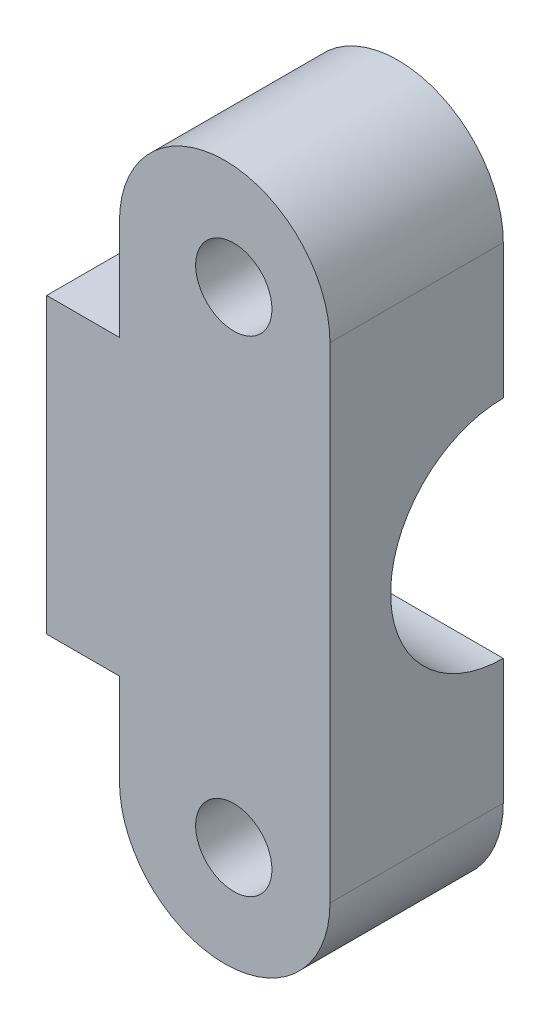
ISO-10303-21;
HEADER;
FILE_DESCRIPTION(('STEP AP214'),'2;1');
FILE_NAME('part.step','',(''),(''),'','','');
FILE_SCHEMA(('AUTOMOTIVE_DESIGN { 1 0 10303 214 1 1 1 1 }'));
ENDSEC;
DATA;
#1=APPLICATION_CONTEXT('core data for automotive mechanical design processes');
#2=APPLICATION_PROTOCOL_DEFINITION('international standard','automotive_design',2000,#1);
#3=PRODUCT_CONTEXT('',#1,'mechanical');
#4=PRODUCT('Part','Part','',(#3));
#5=PRODUCT_RELATED_PRODUCT_CATEGORY('part','',(#4));
#6=PRODUCT_DEFINITION_FORMATION('','',#4);
#7=PRODUCT_DEFINITION_CONTEXT('part definition',#1,'design');
#8=PRODUCT_DEFINITION('design','',#6,#7);
#9=PRODUCT_DEFINITION_SHAPE('','',#8);
#10=(LENGTH_UNIT() NAMED_UNIT(*) SI_UNIT(.MILLI.,.METRE.));
#11=(NAMED_UNIT(*) PLANE_ANGLE_UNIT() SI_UNIT($,.RADIAN.));
#12=(NAMED_UNIT(*) SI_UNIT($,.STERADIAN.) SOLID_ANGLE_UNIT());
#13=UNCERTAINTY_MEASURE_WITH_UNIT(LENGTH_MEASURE(1.E-05),#10,'distance_accuracy_value','');
#14=(GEOMETRIC_REPRESENTATION_CONTEXT(3) GLOBAL_UNCERTAINTY_ASSIGNED_CONTEXT((#13)) GLOBAL_UNIT_ASSIGNED_CONTEXT((#10,
#11,#12)) REPRESENTATION_CONTEXT('',''));
#15=CARTESIAN_POINT('',(0.,0.,0.));
#16=DIRECTION('',(0.,0.,1.));
#17=DIRECTION('',(1.,0.,0.));
#18=AXIS2_PLACEMENT_3D('',#15,#16,#17);
#19=CARTESIAN_POINT('',(-18.8281772838238,40.4550030435916,0.));
#20=DIRECTION('',(0.,0.,1.));
#21=DIRECTION('',(1.,0.,0.));
#22=AXIS2_PLACEMENT_3D('',#19,#20,#21);
#23=PLANE('',#22);
#24=CARTESIAN_POINT('',(-18.566221644103,54.4550030434658,0.));
#25=DIRECTION('',(0.,0.,1.));
#26=DIRECTION('',(1.,0.,0.));
#27=AXIS2_PLACEMENT_3D('',#24,#25,#26);
#28=CIRCLE('',#27,1.09999999999999);
#29=CARTESIAN_POINT('',(-17.466221644103,54.4550030434658,0.));
#30=VERTEX_POINT('',#29);
#31=EDGE_CURVE('E218',#30,#30,#28,.T.);
#32=ORIENTED_EDGE('',*,*,#31,.T.);
#33=EDGE_LOOP('',(#32));
#34=FACE_BOUND('',#33,.T.);
#35=DIRECTION('',(0.,1.,0.));
#36=VECTOR('',#35,1.);
#37=CARTESIAN_POINT('',(-15.7923103646613,40.4550030435916,0.));
#38=LINE('',#37,#36);
#39=CARTESIAN_POINT('',(-15.7923103646613,50.5668589250387,0.));
#40=VERTEX_POINT('',#39);
#41=CARTESIAN_POINT('',(-15.7923103646613,54.4550030435916,0.));
#42=VERTEX_POINT('',#41);
#43=EDGE_CURVE('E130',#40,#42,#38,.T.);
#44=ORIENTED_EDGE('',*,*,#43,.F.);
#45=DIRECTION('',(-1.,0.,0.));
#46=VECTOR('',#45,1.);
#47=CARTESIAN_POINT('',(-15.7923103646613,50.5668589250387,0.));
#48=LINE('',#47,#46);
#49=CARTESIAN_POINT('',(-23.9629628162846,50.5668589250387,0.));
#50=VERTEX_POINT('',#49);
#51=EDGE_CURVE('E48',#40,#50,#48,.T.);
#52=ORIENTED_EDGE('',*,*,#51,.T.);
#53=DIRECTION('',(0.,-1.,0.));
#54=VECTOR('',#53,1.);
#55=CARTESIAN_POINT('',(-23.9629628162846,51.547447727193,0.));
#56=LINE('',#55,#54);
#57=CARTESIAN_POINT('',(-23.9629628162846,51.547447727193,0.));
#58=VERTEX_POINT('',#57);
#59=EDGE_CURVE('E191',#58,#50,#56,.T.);
#60=ORIENTED_EDGE('',*,*,#59,.F.);
#61=DIRECTION('',(-1.,0.,0.));
#62=VECTOR('',#61,1.);
#63=CARTESIAN_POINT('',(-21.8640442029864,51.547447727193,0.));
#64=LINE('',#63,#62);
#65=CARTESIAN_POINT('',(-21.8640442029864,51.547447727193,0.));
#66=VERTEX_POINT('',#65);
#67=EDGE_CURVE('E176',#66,#58,#64,.T.);
#68=ORIENTED_EDGE('',*,*,#67,.F.);
#69=DIRECTION('',(0.,-1.,0.));
#70=VECTOR('',#69,1.);
#71=CARTESIAN_POINT('',(-21.8640442029864,54.4550030435916,0.));
#72=LINE('',#71,#70);
#73=CARTESIAN_POINT('',(-21.8640442029864,54.4550030435916,0.));
#74=VERTEX_POINT('',#73);
#75=EDGE_CURVE('E180',#74,#66,#72,.T.);
#76=ORIENTED_EDGE('',*,*,#75,.F.);
#77=CARTESIAN_POINT('',(-18.8281772838239,54.4550030435916,0.));
#78=DIRECTION('',(0.,0.,1.));
#79=DIRECTION('',(1.,0.,0.));
#80=AXIS2_PLACEMENT_3D('',#77,#78,#79);
#81=CIRCLE('',#80,3.03586691916255);
#82=EDGE_CURVE('E129',#42,#74,#81,.T.);
#83=ORIENTED_EDGE('',*,*,#82,.F.);
#84=EDGE_LOOP('',(#44,#52,#60,#68,#76,#83));
#85=FACE_BOUND('',#84,.T.);
#86=ADVANCED_FACE('F33',(#34,#85),#23,.F.);
#87=CARTESIAN_POINT('',(-18.8281772838238,40.4550030435916,5.));
#88=DIRECTION('',(0.,0.,1.));
#89=DIRECTION('',(1.,0.,0.));
#90=AXIS2_PLACEMENT_3D('',#87,#88,#89);
#91=PLANE('',#90);
#92=CARTESIAN_POINT('',(-18.566221644103,40.4550030434658,5.));
#93=DIRECTION('',(0.,0.,1.));
#94=DIRECTION('',(1.,0.,0.));
#95=AXIS2_PLACEMENT_3D('',#92,#93,#94);
#96=CIRCLE('',#95,1.1);
#97=CARTESIAN_POINT('',(-17.466221644103,40.4550030434658,5.));
#98=VERTEX_POINT('',#97);
#99=EDGE_CURVE('E183',#98,#98,#96,.T.);
#100=ORIENTED_EDGE('',*,*,#99,.F.);
#101=EDGE_LOOP('',(#100));
#102=FACE_BOUND('',#101,.T.);
#103=DIRECTION('',(0.,-1.,0.));
#104=VECTOR('',#103,1.);
#105=CARTESIAN_POINT('',(-21.8640442029864,54.4550030435916,5.));
#106=LINE('',#105,#104);
#107=CARTESIAN_POINT('',(-21.8640442029864,54.4550030435916,5.));
#108=VERTEX_POINT('',#107);
#109=CARTESIAN_POINT('',(-21.8640442029864,51.547447727193,5.));
#110=VERTEX_POINT('',#109);
#111=EDGE_CURVE('E132',#108,#110,#106,.T.);
#112=ORIENTED_EDGE('',*,*,#111,.T.);
#113=DIRECTION('',(-1.,0.,0.));
#114=VECTOR('',#113,1.);
#115=CARTESIAN_POINT('',(-21.8640442029864,51.547447727193,5.));
#116=LINE('',#115,#114);
#117=CARTESIAN_POINT('',(-23.9629628162846,51.547447727193,5.));
#118=VERTEX_POINT('',#117);
#119=EDGE_CURVE('E139',#110,#118,#116,.T.);
#120=ORIENTED_EDGE('',*,*,#119,.T.);
#121=DIRECTION('',(0.,-1.,0.));
#122=VECTOR('',#121,1.);
#123=CARTESIAN_POINT('',(-23.9629628162846,51.547447727193,5.));
#124=LINE('',#123,#122);
#125=CARTESIAN_POINT('',(-23.9629628162846,43.0862701228843,5.));
#126=VERTEX_POINT('',#125);
#127=EDGE_CURVE('E141',#118,#126,#124,.T.);
#128=ORIENTED_EDGE('',*,*,#127,.T.);
#129=DIRECTION('',(1.,0.,0.));
#130=VECTOR('',#129,1.);
#131=CARTESIAN_POINT('',(-21.8640442029864,43.0862701228843,5.));
#132=LINE('',#131,#130);
#133=CARTESIAN_POINT('',(-21.8640442029864,43.0862701228843,5.));
#134=VERTEX_POINT('',#133);
#135=EDGE_CURVE('E143',#126,#134,#132,.T.);
#136=ORIENTED_EDGE('',*,*,#135,.T.);
#137=DIRECTION('',(0.,-1.,0.));
#138=VECTOR('',#137,1.);
#139=CARTESIAN_POINT('',(-21.8640442029864,43.0862701228843,5.));
#140=LINE('',#139,#138);
#141=CARTESIAN_POINT('',(-21.8640442029864,40.4550030435916,5.));
#142=VERTEX_POINT('',#141);
#143=EDGE_CURVE('E145',#134,#142,#140,.T.);
#144=ORIENTED_EDGE('',*,*,#143,.T.);
#145=CARTESIAN_POINT('',(-18.8281772838238,40.4550030435916,5.));
#146=DIRECTION('',(0.,0.,1.));
#147=DIRECTION('',(1.,0.,0.));
#148=AXIS2_PLACEMENT_3D('',#145,#146,#147);
#149=CIRCLE('',#148,3.03586691916257);
#150=CARTESIAN_POINT('',(-15.7923103646613,40.4550030435916,5.));
#151=VERTEX_POINT('',#150);
#152=EDGE_CURVE('E147',#142,#151,#149,.T.);
#153=ORIENTED_EDGE('',*,*,#152,.T.);
#154=DIRECTION('',(0.,1.,0.));
#155=VECTOR('',#154,1.);
#156=CARTESIAN_POINT('',(-15.7923103646613,40.4550030435916,5.));
#157=LINE('',#156,#155);
#158=CARTESIAN_POINT('',(-15.7923103646613,54.4550030435916,5.));
#159=VERTEX_POINT('',#158);
#160=EDGE_CURVE('E149',#151,#159,#157,.T.);
#161=ORIENTED_EDGE('',*,*,#160,.T.);
#162=CARTESIAN_POINT('',(-18.8281772838239,54.4550030435916,5.));
#163=DIRECTION('',(0.,0.,1.));
#164=DIRECTION('',(1.,0.,0.));
#165=AXIS2_PLACEMENT_3D('',#162,#163,#164);
#166=CIRCLE('',#165,3.03586691916255);
#167=EDGE_CURVE('E55',#159,#108,#166,.T.);
#168=ORIENTED_EDGE('',*,*,#167,.T.);
#169=EDGE_LOOP('',(#112,#120,#128,#136,#144,#153,#161,#168));
#170=FACE_BOUND('',#169,.T.);
#171=CARTESIAN_POINT('',(-18.566221644103,54.4550030434658,5.));
#172=DIRECTION('',(0.,0.,1.));
#173=DIRECTION('',(1.,0.,0.));
#174=AXIS2_PLACEMENT_3D('',#171,#172,#173);
#175=CIRCLE('',#174,1.09999999999999);
#176=CARTESIAN_POINT('',(-17.466221644103,54.4550030434658,5.));
#177=VERTEX_POINT('',#176);
#178=EDGE_CURVE('E221',#177,#177,#175,.T.);
#179=ORIENTED_EDGE('',*,*,#178,.F.);
#180=EDGE_LOOP('',(#179));
#181=FACE_BOUND('',#180,.T.);
#182=ADVANCED_FACE('F209',(#102,#170,#181),#91,.T.);
#183=CARTESIAN_POINT('',(-18.566221644103,40.4550030434658,0.));
#184=DIRECTION('',(0.,0.,1.));
#185=DIRECTION('',(1.,0.,0.));
#186=AXIS2_PLACEMENT_3D('',#183,#184,#185);
#187=CIRCLE('',#186,1.1);
#188=CARTESIAN_POINT('',(-17.466221644103,40.4550030434658,0.));
#189=VERTEX_POINT('',#188);
#190=EDGE_CURVE('E187',#189,#189,#187,.T.);
#191=ORIENTED_EDGE('',*,*,#190,.T.);
#192=EDGE_LOOP('',(#191));
#193=FACE_BOUND('',#192,.T.);
#194=CARTESIAN_POINT('',(-23.9629628162846,44.0668589250387,0.));
#195=VERTEX_POINT('',#194);
#196=CARTESIAN_POINT('',(-23.9629628162846,43.0862701228843,0.));
#197=VERTEX_POINT('',#196);
#198=EDGE_CURVE('E121',#195,#197,#56,.T.);
#199=ORIENTED_EDGE('',*,*,#198,.F.);
#200=DIRECTION('',(-1.,0.,0.));
#201=VECTOR('',#200,1.);
#202=CARTESIAN_POINT('',(-15.7923103646613,44.0668589250387,0.));
#203=LINE('',#202,#201);
#204=CARTESIAN_POINT('',(-15.7923103646613,44.0668589250387,0.));
#205=VERTEX_POINT('',#204);
#206=EDGE_CURVE('E109',#195,#205,#203,.F.);
#207=ORIENTED_EDGE('',*,*,#206,.T.);
#208=CARTESIAN_POINT('',(-15.7923103646613,40.4550030435916,0.));
#209=VERTEX_POINT('',#208);
#210=EDGE_CURVE('E119',#209,#205,#38,.T.);
#211=ORIENTED_EDGE('',*,*,#210,.F.);
#212=CARTESIAN_POINT('',(-18.8281772838238,40.4550030435916,0.));
#213=DIRECTION('',(0.,0.,1.));
#214=DIRECTION('',(1.,0.,0.));
#215=AXIS2_PLACEMENT_3D('',#212,#213,#214);
#216=CIRCLE('',#215,3.03586691916257);
#217=CARTESIAN_POINT('',(-21.8640442029864,40.4550030435916,0.));
#218=VERTEX_POINT('',#217);
#219=EDGE_CURVE('E134',#218,#209,#216,.T.);
#220=ORIENTED_EDGE('',*,*,#219,.F.);
#221=DIRECTION('',(0.,-1.,0.));
#222=VECTOR('',#221,1.);
#223=CARTESIAN_POINT('',(-21.8640442029864,43.0862701228843,0.));
#224=LINE('',#223,#222);
#225=CARTESIAN_POINT('',(-21.8640442029864,43.0862701228843,0.));
#226=VERTEX_POINT('',#225);
#227=EDGE_CURVE('E195',#226,#218,#224,.T.);
#228=ORIENTED_EDGE('',*,*,#227,.F.);
#229=DIRECTION('',(1.,0.,0.));
#230=VECTOR('',#229,1.);
#231=CARTESIAN_POINT('',(-21.8640442029864,43.0862701228843,0.));
#232=LINE('',#231,#230);
#233=EDGE_CURVE('E194',#197,#226,#232,.T.);
#234=ORIENTED_EDGE('',*,*,#233,.F.);
#235=EDGE_LOOP('',(#199,#207,#211,#220,#228,#234));
#236=FACE_BOUND('',#235,.T.);
#237=ADVANCED_FACE('F117',(#193,#236),#23,.F.);
#238=CARTESIAN_POINT('',(-21.8640442029864,54.4550030435916,5.));
#239=DIRECTION('',(1.,0.,0.));
#240=DIRECTION('',(0.,0.,-1.));
#241=AXIS2_PLACEMENT_3D('',#238,#239,#240);
#242=PLANE('',#241);
#243=ORIENTED_EDGE('',*,*,#75,.T.);
#244=DIRECTION('',(0.,0.,-1.));
#245=VECTOR('',#244,1.);
#246=CARTESIAN_POINT('',(-21.8640442029864,51.547447727193,5.));
#247=LINE('',#246,#245);
#248=EDGE_CURVE('E41',#110,#66,#247,.T.);
#249=ORIENTED_EDGE('',*,*,#248,.F.);
#250=ORIENTED_EDGE('',*,*,#111,.F.);
#251=DIRECTION('',(0.,0.,-1.));
#252=VECTOR('',#251,1.);
#253=CARTESIAN_POINT('',(-21.8640442029864,54.4550030435916,5.));
#254=LINE('',#253,#252);
#255=EDGE_CURVE('E152',#108,#74,#254,.T.);
#256=ORIENTED_EDGE('',*,*,#255,.T.);
#257=EDGE_LOOP('',(#243,#249,#250,#256));
#258=FACE_BOUND('',#257,.T.);
#259=ADVANCED_FACE('F35',(#258),#242,.F.);
#260=CARTESIAN_POINT('',(-21.8640442029864,51.547447727193,5.));
#261=DIRECTION('',(0.,-1.,0.));
#262=DIRECTION('',(0.,0.,-1.));
#263=AXIS2_PLACEMENT_3D('',#260,#261,#262);
#264=PLANE('',#263);
#265=ORIENTED_EDGE('',*,*,#67,.T.);
#266=DIRECTION('',(0.,0.,-1.));
#267=VECTOR('',#266,1.);
#268=CARTESIAN_POINT('',(-23.9629628162846,51.547447727193,5.));
#269=LINE('',#268,#267);
#270=EDGE_CURVE('E168',#118,#58,#269,.T.);
#271=ORIENTED_EDGE('',*,*,#270,.F.);
#272=ORIENTED_EDGE('',*,*,#119,.F.);
#273=ORIENTED_EDGE('',*,*,#248,.T.);
#274=EDGE_LOOP('',(#265,#271,#272,#273));
#275=FACE_BOUND('',#274,.T.);
#276=ADVANCED_FACE('F174',(#275),#264,.F.);
#277=CARTESIAN_POINT('',(-23.9629628162846,51.547447727193,5.));
#278=DIRECTION('',(1.,0.,0.));
#279=DIRECTION('',(0.,0.,-1.));
#280=AXIS2_PLACEMENT_3D('',#277,#278,#279);
#281=PLANE('',#280);
#282=ORIENTED_EDGE('',*,*,#59,.T.);
#283=CARTESIAN_POINT('',(-23.9629628162846,47.3168589250387,0.));
#284=DIRECTION('',(-1.,0.,0.));
#285=DIRECTION('',(0.,0.,1.));
#286=AXIS2_PLACEMENT_3D('',#283,#284,#285);
#287=CIRCLE('',#286,3.25);
#288=EDGE_CURVE('E122',#195,#50,#287,.T.);
#289=ORIENTED_EDGE('',*,*,#288,.F.);
#290=ORIENTED_EDGE('',*,*,#198,.T.);
#291=DIRECTION('',(0.,0.,-1.));
#292=VECTOR('',#291,1.);
#293=CARTESIAN_POINT('',(-23.9629628162846,43.0862701228843,5.));
#294=LINE('',#293,#292);
#295=EDGE_CURVE('E165',#126,#197,#294,.T.);
#296=ORIENTED_EDGE('',*,*,#295,.F.);
#297=ORIENTED_EDGE('',*,*,#127,.F.);
#298=ORIENTED_EDGE('',*,*,#270,.T.);
#299=EDGE_LOOP('',(#282,#289,#290,#296,#297,#298));
#300=FACE_BOUND('',#299,.T.);
#301=ADVANCED_FACE('F213',(#300),#281,.F.);
#302=CARTESIAN_POINT('',(-21.8640442029864,43.0862701228843,5.));
#303=DIRECTION('',(0.,1.,0.));
#304=DIRECTION('',(0.,0.,1.));
#305=AXIS2_PLACEMENT_3D('',#302,#303,#304);
#306=PLANE('',#305);
#307=ORIENTED_EDGE('',*,*,#233,.T.);
#308=DIRECTION('',(0.,0.,-1.));
#309=VECTOR('',#308,1.);
#310=CARTESIAN_POINT('',(-21.8640442029864,43.0862701228843,5.));
#311=LINE('',#310,#309);
#312=EDGE_CURVE('E162',#134,#226,#311,.T.);
#313=ORIENTED_EDGE('',*,*,#312,.F.);
#314=ORIENTED_EDGE('',*,*,#135,.F.);
#315=ORIENTED_EDGE('',*,*,#295,.T.);
#316=EDGE_LOOP('',(#307,#313,#314,#315));
#317=FACE_BOUND('',#316,.T.);
#318=ADVANCED_FACE('F204',(#317),#306,.F.);
#319=CARTESIAN_POINT('',(-21.8640442029864,43.0862701228843,5.));
#320=DIRECTION('',(1.,0.,0.));
#321=DIRECTION('',(0.,0.,-1.));
#322=AXIS2_PLACEMENT_3D('',#319,#320,#321);
#323=PLANE('',#322);
#324=ORIENTED_EDGE('',*,*,#227,.T.);
#325=DIRECTION('',(0.,0.,-1.));
#326=VECTOR('',#325,1.);
#327=CARTESIAN_POINT('',(-21.8640442029864,40.4550030435916,5.));
#328=LINE('',#327,#326);
#329=EDGE_CURVE('E159',#142,#218,#328,.T.);
#330=ORIENTED_EDGE('',*,*,#329,.F.);
#331=ORIENTED_EDGE('',*,*,#143,.F.);
#332=ORIENTED_EDGE('',*,*,#312,.T.);
#333=EDGE_LOOP('',(#324,#330,#331,#332));
#334=FACE_BOUND('',#333,.T.);
#335=ADVANCED_FACE('F208',(#334),#323,.F.);
#336=CARTESIAN_POINT('',(-18.8281772838238,40.4550030435916,5.));
#337=DIRECTION('',(0.,0.,-1.));
#338=DIRECTION('',(-1.,0.,0.));
#339=AXIS2_PLACEMENT_3D('',#336,#337,#338);
#340=CYLINDRICAL_SURFACE('',#339,3.03586691916257);
#341=ORIENTED_EDGE('',*,*,#219,.T.);
#342=DIRECTION('',(0.,0.,-1.));
#343=VECTOR('',#342,1.);
#344=CARTESIAN_POINT('',(-15.7923103646613,40.4550030435916,5.));
#345=LINE('',#344,#343);
#346=EDGE_CURVE('E128',#151,#209,#345,.T.);
#347=ORIENTED_EDGE('',*,*,#346,.F.);
#348=ORIENTED_EDGE('',*,*,#152,.F.);
#349=ORIENTED_EDGE('',*,*,#329,.T.);
#350=EDGE_LOOP('',(#341,#347,#348,#349));
#351=FACE_BOUND('',#350,.T.);
#352=ADVANCED_FACE('F200',(#351),#340,.T.);
#353=CARTESIAN_POINT('',(-15.7923103646613,40.4550030435916,5.));
#354=DIRECTION('',(-1.,0.,0.));
#355=DIRECTION('',(0.,-1.,0.));
#356=AXIS2_PLACEMENT_3D('',#353,#354,#355);
#357=PLANE('',#356);
#358=ORIENTED_EDGE('',*,*,#210,.T.);
#359=CARTESIAN_POINT('',(-15.7923103646613,47.3168589250387,0.));
#360=DIRECTION('',(-1.,0.,0.));
#361=DIRECTION('',(0.,-1.,0.));
#362=AXIS2_PLACEMENT_3D('',#359,#360,#361);
#363=CIRCLE('',#362,3.25);
#364=EDGE_CURVE('E11',#205,#40,#363,.T.);
#365=ORIENTED_EDGE('',*,*,#364,.T.);
#366=ORIENTED_EDGE('',*,*,#43,.T.);
#367=DIRECTION('',(0.,0.,-1.));
#368=VECTOR('',#367,1.);
#369=CARTESIAN_POINT('',(-15.7923103646613,54.4550030435916,5.));
#370=LINE('',#369,#368);
#371=EDGE_CURVE('E155',#159,#42,#370,.T.);
#372=ORIENTED_EDGE('',*,*,#371,.F.);
#373=ORIENTED_EDGE('',*,*,#160,.F.);
#374=ORIENTED_EDGE('',*,*,#346,.T.);
#375=EDGE_LOOP('',(#358,#365,#366,#372,#373,#374));
#376=FACE_BOUND('',#375,.T.);
#377=ADVANCED_FACE('F125',(#376),#357,.F.);
#378=CARTESIAN_POINT('',(-18.8281772838239,54.4550030435916,5.));
#379=DIRECTION('',(0.,0.,-1.));
#380=DIRECTION('',(-1.,0.,0.));
#381=AXIS2_PLACEMENT_3D('',#378,#379,#380);
#382=CYLINDRICAL_SURFACE('',#381,3.03586691916255);
#383=ORIENTED_EDGE('',*,*,#82,.T.);
#384=ORIENTED_EDGE('',*,*,#255,.F.);
#385=ORIENTED_EDGE('',*,*,#167,.F.);
#386=ORIENTED_EDGE('',*,*,#371,.T.);
#387=EDGE_LOOP('',(#383,#384,#385,#386));
#388=FACE_BOUND('',#387,.T.);
#389=ADVANCED_FACE('F230',(#388),#382,.T.);
#390=CARTESIAN_POINT('',(-18.566221644103,40.4550030434658,5.));
#391=DIRECTION('',(0.,0.,-1.));
#392=DIRECTION('',(-1.,0.,0.));
#393=AXIS2_PLACEMENT_3D('',#390,#391,#392);
#394=CYLINDRICAL_SURFACE('',#393,1.1);
#395=ORIENTED_EDGE('',*,*,#99,.T.);
#396=EDGE_LOOP('',(#395));
#397=FACE_BOUND('',#396,.T.);
#398=ORIENTED_EDGE('',*,*,#190,.F.);
#399=EDGE_LOOP('',(#398));
#400=FACE_BOUND('',#399,.T.);
#401=ADVANCED_FACE('F227',(#397,#400),#394,.F.);
#402=CARTESIAN_POINT('',(-18.566221644103,54.4550030434658,5.));
#403=DIRECTION('',(0.,0.,-1.));
#404=DIRECTION('',(-1.,0.,0.));
#405=AXIS2_PLACEMENT_3D('',#402,#403,#404);
#406=CYLINDRICAL_SURFACE('',#405,1.09999999999999);
#407=ORIENTED_EDGE('',*,*,#178,.T.);
#408=EDGE_LOOP('',(#407));
#409=FACE_BOUND('',#408,.T.);
#410=ORIENTED_EDGE('',*,*,#31,.F.);
#411=EDGE_LOOP('',(#410));
#412=FACE_BOUND('',#411,.T.);
#413=ADVANCED_FACE('F229',(#409,#412),#406,.F.);
#414=CARTESIAN_POINT('',(-15.7923103646613,47.3168589250387,0.));
#415=DIRECTION('',(-1.,0.,0.));
#416=DIRECTION('',(0.,0.,1.));
#417=AXIS2_PLACEMENT_3D('',#414,#415,#416);
#418=CYLINDRICAL_SURFACE('',#417,3.25);
#419=ORIENTED_EDGE('',*,*,#364,.F.);
#420=ORIENTED_EDGE('',*,*,#206,.F.);
#421=ORIENTED_EDGE('',*,*,#288,.T.);
#422=ORIENTED_EDGE('',*,*,#51,.F.);
#423=EDGE_LOOP('',(#419,#420,#421,#422));
#424=FACE_BOUND('',#423,.T.);
#425=ADVANCED_FACE('F108',(#424),#418,.F.);
#426=CLOSED_SHELL('',(#86,#182,#237,#259,#276,#301,#318,#335,#352,#377,#389,#401,#413,#425));
#427=MANIFOLD_SOLID_BREP('B2',#426);
#428=ADVANCED_BREP_SHAPE_REPRESENTATION('',(#18,#427),#14);
#429=SHAPE_DEFINITION_REPRESENTATION(#9,#428);
ENDSEC;
END-ISO-10303-21;
